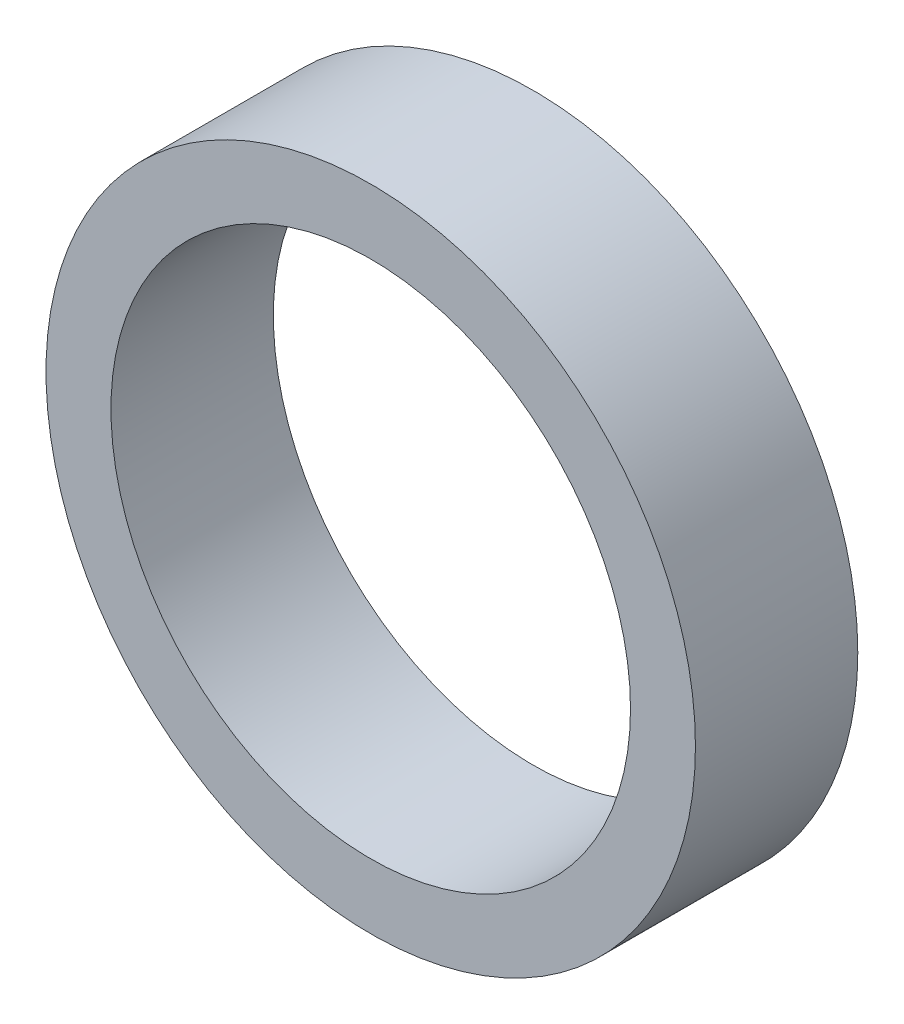
ISO-10303-21;
HEADER;
FILE_DESCRIPTION(('STEP AP214'),'2;1');
FILE_NAME('part.step','',(''),(''),'','','');
FILE_SCHEMA(('AUTOMOTIVE_DESIGN { 1 0 10303 214 1 1 1 1 }'));
ENDSEC;
DATA;
#1=APPLICATION_CONTEXT('core data for automotive mechanical design processes');
#2=APPLICATION_PROTOCOL_DEFINITION('international standard','automotive_design',2000,#1);
#3=PRODUCT_CONTEXT('',#1,'mechanical');
#4=PRODUCT('Part','Part','',(#3));
#5=PRODUCT_RELATED_PRODUCT_CATEGORY('part','',(#4));
#6=PRODUCT_DEFINITION_FORMATION('','',#4);
#7=PRODUCT_DEFINITION_CONTEXT('part definition',#1,'design');
#8=PRODUCT_DEFINITION('design','',#6,#7);
#9=PRODUCT_DEFINITION_SHAPE('','',#8);
#10=(LENGTH_UNIT() NAMED_UNIT(*) SI_UNIT(.MILLI.,.METRE.));
#11=(NAMED_UNIT(*) PLANE_ANGLE_UNIT() SI_UNIT($,.RADIAN.));
#12=(NAMED_UNIT(*) SI_UNIT($,.STERADIAN.) SOLID_ANGLE_UNIT());
#13=UNCERTAINTY_MEASURE_WITH_UNIT(LENGTH_MEASURE(1.E-05),#10,'distance_accuracy_value','');
#14=(GEOMETRIC_REPRESENTATION_CONTEXT(3) GLOBAL_UNCERTAINTY_ASSIGNED_CONTEXT((#13)) GLOBAL_UNIT_ASSIGNED_CONTEXT((#10,
#11,#12)) REPRESENTATION_CONTEXT('',''));
#15=CARTESIAN_POINT('',(0.,0.,0.));
#16=DIRECTION('',(0.,0.,1.));
#17=DIRECTION('',(1.,0.,0.));
#18=AXIS2_PLACEMENT_3D('',#15,#16,#17);
#19=CARTESIAN_POINT('',(0.,0.,-2.75));
#20=DIRECTION('',(0.,0.,1.));
#21=DIRECTION('',(1.,0.,0.));
#22=AXIS2_PLACEMENT_3D('',#19,#20,#21);
#23=CYLINDRICAL_SURFACE('',#22,4.);
#24=CARTESIAN_POINT('',(0.,0.,-4.));
#25=DIRECTION('',(0.,0.,1.));
#26=DIRECTION('',(1.,0.,0.));
#27=AXIS2_PLACEMENT_3D('',#24,#25,#26);
#28=CIRCLE('',#27,4.);
#29=CARTESIAN_POINT('',(4.,0.,-4.));
#30=VERTEX_POINT('',#29);
#31=EDGE_CURVE('E27',#30,#30,#28,.T.);
#32=ORIENTED_EDGE('',*,*,#31,.F.);
#33=EDGE_LOOP('',(#32));
#34=FACE_BOUND('',#33,.T.);
#35=CARTESIAN_POINT('',(0.,0.,-1.5));
#36=DIRECTION('',(0.,0.,1.));
#37=DIRECTION('',(1.,0.,0.));
#38=AXIS2_PLACEMENT_3D('',#35,#36,#37);
#39=CIRCLE('',#38,4.);
#40=CARTESIAN_POINT('',(4.,0.,-1.5));
#41=VERTEX_POINT('',#40);
#42=EDGE_CURVE('E18',#41,#41,#39,.F.);
#43=ORIENTED_EDGE('',*,*,#42,.F.);
#44=EDGE_LOOP('',(#43));
#45=FACE_BOUND('',#44,.T.);
#46=ADVANCED_FACE('F15',(#34,#45),#23,.F.);
#47=CARTESIAN_POINT('',(4.,0.,-1.5));
#48=DIRECTION('',(0.,0.,1.));
#49=DIRECTION('',(1.,0.,0.));
#50=AXIS2_PLACEMENT_3D('',#47,#48,#49);
#51=PLANE('',#50);
#52=ORIENTED_EDGE('',*,*,#42,.T.);
#53=EDGE_LOOP('',(#52));
#54=FACE_BOUND('',#53,.T.);
#55=CARTESIAN_POINT('',(0.,0.,-1.5));
#56=DIRECTION('',(0.,0.,1.));
#57=DIRECTION('',(1.,0.,0.));
#58=AXIS2_PLACEMENT_3D('',#55,#56,#57);
#59=CIRCLE('',#58,5.);
#60=CARTESIAN_POINT('',(5.,0.,-1.5));
#61=VERTEX_POINT('',#60);
#62=EDGE_CURVE('E22',#61,#61,#59,.F.);
#63=ORIENTED_EDGE('',*,*,#62,.F.);
#64=EDGE_LOOP('',(#63));
#65=FACE_BOUND('',#64,.T.);
#66=ADVANCED_FACE('F35',(#54,#65),#51,.T.);
#67=CARTESIAN_POINT('',(5.,0.,-4.));
#68=DIRECTION('',(0.,0.,-1.));
#69=DIRECTION('',(-1.,0.,0.));
#70=AXIS2_PLACEMENT_3D('',#67,#68,#69);
#71=PLANE('',#70);
#72=ORIENTED_EDGE('',*,*,#31,.T.);
#73=EDGE_LOOP('',(#72));
#74=FACE_BOUND('',#73,.T.);
#75=CARTESIAN_POINT('',(0.,0.,-4.));
#76=DIRECTION('',(0.,0.,1.));
#77=DIRECTION('',(1.,0.,0.));
#78=AXIS2_PLACEMENT_3D('',#75,#76,#77);
#79=CIRCLE('',#78,5.);
#80=CARTESIAN_POINT('',(5.,0.,-4.));
#81=VERTEX_POINT('',#80);
#82=EDGE_CURVE('E10',#81,#81,#79,.T.);
#83=ORIENTED_EDGE('',*,*,#82,.F.);
#84=EDGE_LOOP('',(#83));
#85=FACE_BOUND('',#84,.T.);
#86=ADVANCED_FACE('F44',(#74,#85),#71,.T.);
#87=CARTESIAN_POINT('',(0.,0.,-2.75));
#88=DIRECTION('',(0.,0.,1.));
#89=DIRECTION('',(1.,0.,0.));
#90=AXIS2_PLACEMENT_3D('',#87,#88,#89);
#91=CYLINDRICAL_SURFACE('',#90,5.);
#92=ORIENTED_EDGE('',*,*,#82,.T.);
#93=EDGE_LOOP('',(#92));
#94=FACE_BOUND('',#93,.T.);
#95=ORIENTED_EDGE('',*,*,#62,.T.);
#96=EDGE_LOOP('',(#95));
#97=FACE_BOUND('',#96,.T.);
#98=ADVANCED_FACE('F45',(#94,#97),#91,.T.);
#99=CLOSED_SHELL('',(#46,#66,#86,#98));
#100=MANIFOLD_SOLID_BREP('B1',#99);
#101=ADVANCED_BREP_SHAPE_REPRESENTATION('',(#18,#100),#14);
#102=SHAPE_DEFINITION_REPRESENTATION(#9,#101);
ENDSEC;
END-ISO-10303-21;
